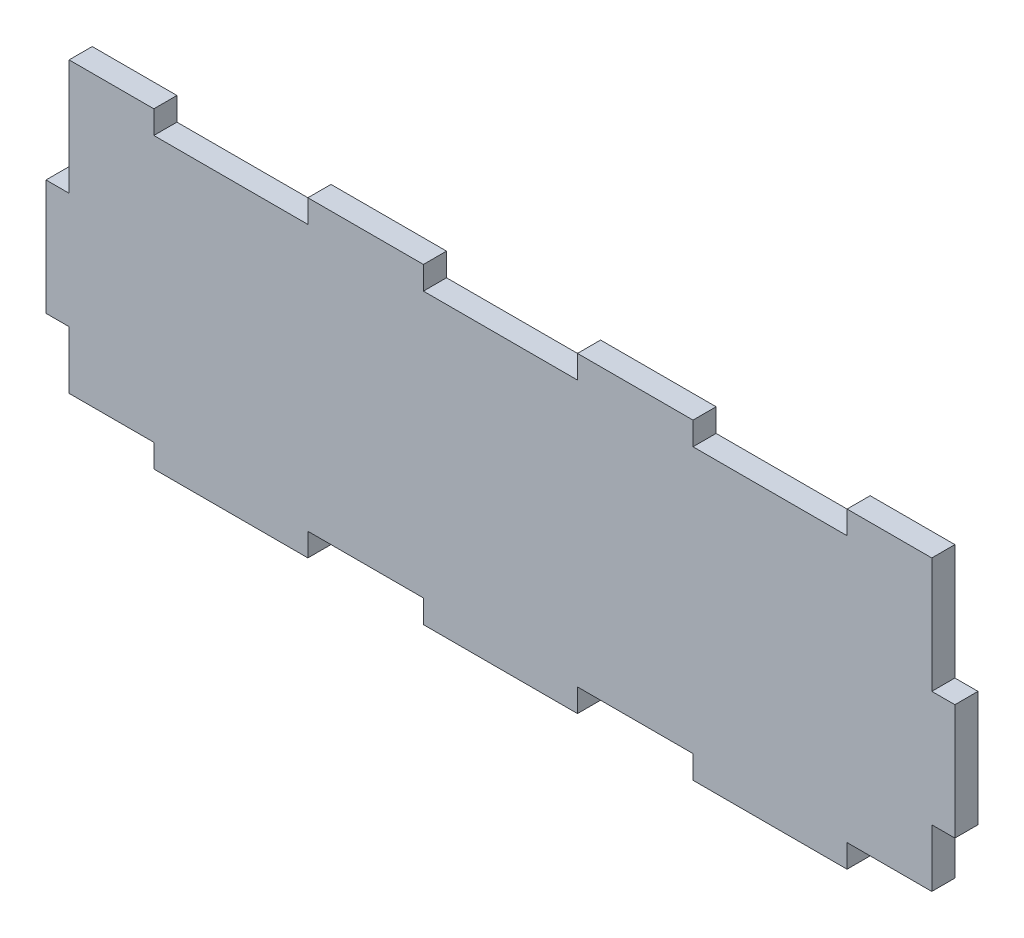
ISO-10303-21;
HEADER;
FILE_DESCRIPTION(('STEP AP214'),'2;1');
FILE_NAME('part.step','',(''),(''),'','','');
FILE_SCHEMA(('AUTOMOTIVE_DESIGN { 1 0 10303 214 1 1 1 1 }'));
ENDSEC;
DATA;
#1=APPLICATION_CONTEXT('core data for automotive mechanical design processes');
#2=APPLICATION_PROTOCOL_DEFINITION('international standard','automotive_design',2000,#1);
#3=PRODUCT_CONTEXT('',#1,'mechanical');
#4=PRODUCT('Part','Part','',(#3));
#5=PRODUCT_RELATED_PRODUCT_CATEGORY('part','',(#4));
#6=PRODUCT_DEFINITION_FORMATION('','',#4);
#7=PRODUCT_DEFINITION_CONTEXT('part definition',#1,'design');
#8=PRODUCT_DEFINITION('design','',#6,#7);
#9=PRODUCT_DEFINITION_SHAPE('','',#8);
#10=(LENGTH_UNIT() NAMED_UNIT(*) SI_UNIT(.MILLI.,.METRE.));
#11=(NAMED_UNIT(*) PLANE_ANGLE_UNIT() SI_UNIT($,.RADIAN.));
#12=(NAMED_UNIT(*) SI_UNIT($,.STERADIAN.) SOLID_ANGLE_UNIT());
#13=UNCERTAINTY_MEASURE_WITH_UNIT(LENGTH_MEASURE(1.E-05),#10,'distance_accuracy_value','');
#14=(GEOMETRIC_REPRESENTATION_CONTEXT(3) GLOBAL_UNCERTAINTY_ASSIGNED_CONTEXT((#13)) GLOBAL_UNIT_ASSIGNED_CONTEXT((#10,
#11,#12)) REPRESENTATION_CONTEXT('',''));
#15=CARTESIAN_POINT('',(0.,0.,0.));
#16=DIRECTION('',(0.,0.,1.));
#17=DIRECTION('',(1.,0.,0.));
#18=AXIS2_PLACEMENT_3D('',#15,#16,#17);
#19=CARTESIAN_POINT('',(-56.,0.,3.));
#20=DIRECTION('',(-1.,0.,0.));
#21=DIRECTION('',(0.,0.,1.));
#22=AXIS2_PLACEMENT_3D('',#19,#20,#21);
#23=PLANE('',#22);
#24=DIRECTION('',(0.,0.,-1.));
#25=VECTOR('',#24,1.);
#26=CARTESIAN_POINT('',(-56.,-7.5,3.));
#27=LINE('',#26,#25);
#28=CARTESIAN_POINT('',(-56.,-7.5,3.));
#29=VERTEX_POINT('',#28);
#30=CARTESIAN_POINT('',(-56.,-7.5,0.));
#31=VERTEX_POINT('',#30);
#32=EDGE_CURVE('E12',#29,#31,#27,.T.);
#33=ORIENTED_EDGE('',*,*,#32,.F.);
#34=DIRECTION('',(0.,1.,0.));
#35=VECTOR('',#34,1.);
#36=CARTESIAN_POINT('',(-56.,0.,3.));
#37=LINE('',#36,#35);
#38=CARTESIAN_POINT('',(-56.,7.5,3.));
#39=VERTEX_POINT('',#38);
#40=EDGE_CURVE('E538',#29,#39,#37,.T.);
#41=ORIENTED_EDGE('',*,*,#40,.T.);
#42=DIRECTION('',(0.,0.,-1.));
#43=VECTOR('',#42,1.);
#44=CARTESIAN_POINT('',(-56.,7.5,3.));
#45=LINE('',#44,#43);
#46=CARTESIAN_POINT('',(-56.,7.5,0.));
#47=VERTEX_POINT('',#46);
#48=EDGE_CURVE('E439',#39,#47,#45,.T.);
#49=ORIENTED_EDGE('',*,*,#48,.T.);
#50=DIRECTION('',(0.,1.,0.));
#51=VECTOR('',#50,1.);
#52=CARTESIAN_POINT('',(-56.,0.,0.));
#53=LINE('',#52,#51);
#54=EDGE_CURVE('E478',#31,#47,#53,.T.);
#55=ORIENTED_EDGE('',*,*,#54,.F.);
#56=EDGE_LOOP('',(#33,#41,#49,#55));
#57=FACE_BOUND('',#56,.T.);
#58=ADVANCED_FACE('F323',(#57),#23,.T.);
#59=CARTESIAN_POINT('',(0.,0.,0.));
#60=DIRECTION('',(0.,0.,1.));
#61=DIRECTION('',(1.,0.,0.));
#62=AXIS2_PLACEMENT_3D('',#59,#60,#61);
#63=PLANE('',#62);
#64=ORIENTED_EDGE('',*,*,#54,.T.);
#65=DIRECTION('',(1.,0.,0.));
#66=VECTOR('',#65,1.);
#67=CARTESIAN_POINT('',(0.,7.5,0.));
#68=LINE('',#67,#66);
#69=CARTESIAN_POINT('',(-45.,7.5,0.));
#70=VERTEX_POINT('',#69);
#71=EDGE_CURVE('E706',#47,#70,#68,.T.);
#72=ORIENTED_EDGE('',*,*,#71,.T.);
#73=DIRECTION('',(0.,1.,0.));
#74=VECTOR('',#73,1.);
#75=CARTESIAN_POINT('',(-45.,0.,0.));
#76=LINE('',#75,#74);
#77=CARTESIAN_POINT('',(-45.,4.5,0.));
#78=VERTEX_POINT('',#77);
#79=EDGE_CURVE('E420',#78,#70,#76,.T.);
#80=ORIENTED_EDGE('',*,*,#79,.F.);
#81=DIRECTION('',(1.,0.,0.));
#82=VECTOR('',#81,1.);
#83=CARTESIAN_POINT('',(0.,4.5,0.));
#84=LINE('',#83,#82);
#85=CARTESIAN_POINT('',(-25.,4.5,0.));
#86=VERTEX_POINT('',#85);
#87=EDGE_CURVE('E414',#78,#86,#84,.T.);
#88=ORIENTED_EDGE('',*,*,#87,.T.);
#89=DIRECTION('',(0.,1.,0.));
#90=VECTOR('',#89,1.);
#91=CARTESIAN_POINT('',(-25.,0.,0.));
#92=LINE('',#91,#90);
#93=CARTESIAN_POINT('',(-25.,7.5,0.));
#94=VERTEX_POINT('',#93);
#95=EDGE_CURVE('E702',#86,#94,#92,.T.);
#96=ORIENTED_EDGE('',*,*,#95,.T.);
#97=DIRECTION('',(1.,0.,0.));
#98=VECTOR('',#97,1.);
#99=CARTESIAN_POINT('',(0.,7.5,0.));
#100=LINE('',#99,#98);
#101=CARTESIAN_POINT('',(-9.99999999999999,7.5,0.));
#102=VERTEX_POINT('',#101);
#103=EDGE_CURVE('E698',#94,#102,#100,.T.);
#104=ORIENTED_EDGE('',*,*,#103,.T.);
#105=DIRECTION('',(0.,1.,0.));
#106=VECTOR('',#105,1.);
#107=CARTESIAN_POINT('',(-9.99999999999999,0.,0.));
#108=LINE('',#107,#106);
#109=CARTESIAN_POINT('',(-9.99999999999999,4.5,0.));
#110=VERTEX_POINT('',#109);
#111=EDGE_CURVE('E694',#110,#102,#108,.T.);
#112=ORIENTED_EDGE('',*,*,#111,.F.);
#113=DIRECTION('',(1.,0.,0.));
#114=VECTOR('',#113,1.);
#115=CARTESIAN_POINT('',(0.,4.5,0.));
#116=LINE('',#115,#114);
#117=CARTESIAN_POINT('',(10.,4.5,0.));
#118=VERTEX_POINT('',#117);
#119=EDGE_CURVE('E690',#110,#118,#116,.T.);
#120=ORIENTED_EDGE('',*,*,#119,.T.);
#121=DIRECTION('',(0.,1.,0.));
#122=VECTOR('',#121,1.);
#123=CARTESIAN_POINT('',(10.,0.,0.));
#124=LINE('',#123,#122);
#125=CARTESIAN_POINT('',(10.,7.5,0.));
#126=VERTEX_POINT('',#125);
#127=EDGE_CURVE('E686',#118,#126,#124,.T.);
#128=ORIENTED_EDGE('',*,*,#127,.T.);
#129=DIRECTION('',(1.,0.,0.));
#130=VECTOR('',#129,1.);
#131=CARTESIAN_POINT('',(0.,7.5,0.));
#132=LINE('',#131,#130);
#133=CARTESIAN_POINT('',(25.,7.5,0.));
#134=VERTEX_POINT('',#133);
#135=EDGE_CURVE('E682',#126,#134,#132,.T.);
#136=ORIENTED_EDGE('',*,*,#135,.T.);
#137=DIRECTION('',(0.,1.,0.));
#138=VECTOR('',#137,1.);
#139=CARTESIAN_POINT('',(25.,0.,0.));
#140=LINE('',#139,#138);
#141=CARTESIAN_POINT('',(25.,4.5,0.));
#142=VERTEX_POINT('',#141);
#143=EDGE_CURVE('E678',#142,#134,#140,.T.);
#144=ORIENTED_EDGE('',*,*,#143,.F.);
#145=DIRECTION('',(-1.,0.,0.));
#146=VECTOR('',#145,1.);
#147=CARTESIAN_POINT('',(0.,4.5,0.));
#148=LINE('',#147,#146);
#149=CARTESIAN_POINT('',(45.,4.5,0.));
#150=VERTEX_POINT('',#149);
#151=EDGE_CURVE('E674',#150,#142,#148,.T.);
#152=ORIENTED_EDGE('',*,*,#151,.F.);
#153=DIRECTION('',(0.,1.,0.));
#154=VECTOR('',#153,1.);
#155=CARTESIAN_POINT('',(45.,0.,0.));
#156=LINE('',#155,#154);
#157=CARTESIAN_POINT('',(45.,7.5,0.));
#158=VERTEX_POINT('',#157);
#159=EDGE_CURVE('E670',#150,#158,#156,.T.);
#160=ORIENTED_EDGE('',*,*,#159,.T.);
#161=DIRECTION('',(1.,0.,0.));
#162=VECTOR('',#161,1.);
#163=CARTESIAN_POINT('',(0.,7.5,0.));
#164=LINE('',#163,#162);
#165=CARTESIAN_POINT('',(56.,7.5,0.));
#166=VERTEX_POINT('',#165);
#167=EDGE_CURVE('E710',#158,#166,#164,.T.);
#168=ORIENTED_EDGE('',*,*,#167,.T.);
#169=DIRECTION('',(0.,1.,0.));
#170=VECTOR('',#169,1.);
#171=CARTESIAN_POINT('',(56.,0.,0.));
#172=LINE('',#171,#170);
#173=CARTESIAN_POINT('',(56.,-7.5,0.));
#174=VERTEX_POINT('',#173);
#175=EDGE_CURVE('E531',#174,#166,#172,.T.);
#176=ORIENTED_EDGE('',*,*,#175,.F.);
#177=DIRECTION('',(-1.,0.,0.));
#178=VECTOR('',#177,1.);
#179=CARTESIAN_POINT('',(59.,-7.5,0.));
#180=LINE('',#179,#178);
#181=CARTESIAN_POINT('',(59.,-7.5,0.));
#182=VERTEX_POINT('',#181);
#183=EDGE_CURVE('E457',#182,#174,#180,.T.);
#184=ORIENTED_EDGE('',*,*,#183,.F.);
#185=DIRECTION('',(0.,1.,0.));
#186=VECTOR('',#185,1.);
#187=CARTESIAN_POINT('',(59.,-22.5,0.));
#188=LINE('',#187,#186);
#189=CARTESIAN_POINT('',(59.,-22.5,0.));
#190=VERTEX_POINT('',#189);
#191=EDGE_CURVE('E460',#190,#182,#188,.T.);
#192=ORIENTED_EDGE('',*,*,#191,.F.);
#193=DIRECTION('',(-1.,0.,0.));
#194=VECTOR('',#193,1.);
#195=CARTESIAN_POINT('',(59.,-22.5,0.));
#196=LINE('',#195,#194);
#197=CARTESIAN_POINT('',(56.,-22.5,0.));
#198=VERTEX_POINT('',#197);
#199=EDGE_CURVE('E397',#190,#198,#196,.T.);
#200=ORIENTED_EDGE('',*,*,#199,.T.);
#201=CARTESIAN_POINT('',(56.,-30.,0.));
#202=VERTEX_POINT('',#201);
#203=EDGE_CURVE('E534',#202,#198,#172,.T.);
#204=ORIENTED_EDGE('',*,*,#203,.F.);
#205=DIRECTION('',(-1.,0.,0.));
#206=VECTOR('',#205,1.);
#207=CARTESIAN_POINT('',(0.,-30.,0.));
#208=LINE('',#207,#206);
#209=CARTESIAN_POINT('',(45.,-30.,0.));
#210=VERTEX_POINT('',#209);
#211=EDGE_CURVE('E487',#202,#210,#208,.T.);
#212=ORIENTED_EDGE('',*,*,#211,.T.);
#213=DIRECTION('',(0.,1.,0.));
#214=VECTOR('',#213,1.);
#215=CARTESIAN_POINT('',(45.,0.,0.));
#216=LINE('',#215,#214);
#217=CARTESIAN_POINT('',(45.,-33.,0.));
#218=VERTEX_POINT('',#217);
#219=EDGE_CURVE('E524',#218,#210,#216,.T.);
#220=ORIENTED_EDGE('',*,*,#219,.F.);
#221=DIRECTION('',(1.,0.,0.));
#222=VECTOR('',#221,1.);
#223=CARTESIAN_POINT('',(0.,-33.,0.));
#224=LINE('',#223,#222);
#225=CARTESIAN_POINT('',(25.,-33.,0.));
#226=VERTEX_POINT('',#225);
#227=EDGE_CURVE('E520',#226,#218,#224,.T.);
#228=ORIENTED_EDGE('',*,*,#227,.F.);
#229=DIRECTION('',(0.,1.,0.));
#230=VECTOR('',#229,1.);
#231=CARTESIAN_POINT('',(25.,0.,0.));
#232=LINE('',#231,#230);
#233=CARTESIAN_POINT('',(25.,-30.,0.));
#234=VERTEX_POINT('',#233);
#235=EDGE_CURVE('E517',#226,#234,#232,.T.);
#236=ORIENTED_EDGE('',*,*,#235,.T.);
#237=CARTESIAN_POINT('',(10.,-30.,0.));
#238=VERTEX_POINT('',#237);
#239=EDGE_CURVE('E503',#234,#238,#208,.T.);
#240=ORIENTED_EDGE('',*,*,#239,.T.);
#241=DIRECTION('',(0.,1.,0.));
#242=VECTOR('',#241,1.);
#243=CARTESIAN_POINT('',(10.,0.,0.));
#244=LINE('',#243,#242);
#245=CARTESIAN_POINT('',(10.,-33.,0.));
#246=VERTEX_POINT('',#245);
#247=EDGE_CURVE('E510',#246,#238,#244,.T.);
#248=ORIENTED_EDGE('',*,*,#247,.F.);
#249=DIRECTION('',(1.,0.,0.));
#250=VECTOR('',#249,1.);
#251=CARTESIAN_POINT('',(0.,-33.,0.));
#252=LINE('',#251,#250);
#253=CARTESIAN_POINT('',(-10.,-33.,0.));
#254=VERTEX_POINT('',#253);
#255=EDGE_CURVE('E506',#254,#246,#252,.T.);
#256=ORIENTED_EDGE('',*,*,#255,.F.);
#257=DIRECTION('',(0.,1.,0.));
#258=VECTOR('',#257,1.);
#259=CARTESIAN_POINT('',(-10.,0.,0.));
#260=LINE('',#259,#258);
#261=CARTESIAN_POINT('',(-10.,-30.,0.));
#262=VERTEX_POINT('',#261);
#263=EDGE_CURVE('E502',#254,#262,#260,.T.);
#264=ORIENTED_EDGE('',*,*,#263,.T.);
#265=CARTESIAN_POINT('',(-25.,-30.,0.));
#266=VERTEX_POINT('',#265);
#267=EDGE_CURVE('E488',#262,#266,#208,.T.);
#268=ORIENTED_EDGE('',*,*,#267,.T.);
#269=DIRECTION('',(0.,1.,0.));
#270=VECTOR('',#269,1.);
#271=CARTESIAN_POINT('',(-25.,0.,0.));
#272=LINE('',#271,#270);
#273=CARTESIAN_POINT('',(-25.,-33.,0.));
#274=VERTEX_POINT('',#273);
#275=EDGE_CURVE('E495',#274,#266,#272,.T.);
#276=ORIENTED_EDGE('',*,*,#275,.F.);
#277=DIRECTION('',(-1.,0.,0.));
#278=VECTOR('',#277,1.);
#279=CARTESIAN_POINT('',(0.,-33.,0.));
#280=LINE('',#279,#278);
#281=CARTESIAN_POINT('',(-45.,-33.,0.));
#282=VERTEX_POINT('',#281);
#283=EDGE_CURVE('E491',#274,#282,#280,.T.);
#284=ORIENTED_EDGE('',*,*,#283,.T.);
#285=DIRECTION('',(0.,1.,0.));
#286=VECTOR('',#285,1.);
#287=CARTESIAN_POINT('',(-45.,0.,0.));
#288=LINE('',#287,#286);
#289=CARTESIAN_POINT('',(-45.,-30.,0.));
#290=VERTEX_POINT('',#289);
#291=EDGE_CURVE('E485',#282,#290,#288,.T.);
#292=ORIENTED_EDGE('',*,*,#291,.T.);
#293=CARTESIAN_POINT('',(-56.,-30.,0.));
#294=VERTEX_POINT('',#293);
#295=EDGE_CURVE('E483',#290,#294,#208,.T.);
#296=ORIENTED_EDGE('',*,*,#295,.T.);
#297=CARTESIAN_POINT('',(-56.,-22.5,0.));
#298=VERTEX_POINT('',#297);
#299=EDGE_CURVE('E407',#294,#298,#53,.T.);
#300=ORIENTED_EDGE('',*,*,#299,.T.);
#301=DIRECTION('',(1.,0.,0.));
#302=VECTOR('',#301,1.);
#303=CARTESIAN_POINT('',(-59.,-22.5,0.));
#304=LINE('',#303,#302);
#305=CARTESIAN_POINT('',(-59.,-22.5,0.));
#306=VERTEX_POINT('',#305);
#307=EDGE_CURVE('E388',#306,#298,#304,.T.);
#308=ORIENTED_EDGE('',*,*,#307,.F.);
#309=DIRECTION('',(0.,1.,0.));
#310=VECTOR('',#309,1.);
#311=CARTESIAN_POINT('',(-59.,-22.5,0.));
#312=LINE('',#311,#310);
#313=CARTESIAN_POINT('',(-59.,-7.5,0.));
#314=VERTEX_POINT('',#313);
#315=EDGE_CURVE('E404',#306,#314,#312,.T.);
#316=ORIENTED_EDGE('',*,*,#315,.T.);
#317=DIRECTION('',(1.,0.,0.));
#318=VECTOR('',#317,1.);
#319=CARTESIAN_POINT('',(-59.,-7.5,0.));
#320=LINE('',#319,#318);
#321=EDGE_CURVE('E410',#314,#31,#320,.T.);
#322=ORIENTED_EDGE('',*,*,#321,.T.);
#323=EDGE_LOOP('',(#64,#72,#80,#88,#96,#104,#112,#120,#128,#136,#144,#152,#160,#168,#176,#184,
#192,#200,#204,#212,#220,#228,#236,#240,#248,#256,#264,#268,#276,#284,#292,#296,#300,#308,#316,#322));
#324=FACE_BOUND('',#323,.T.);
#325=ADVANCED_FACE('F402',(#324),#63,.F.);
#326=CARTESIAN_POINT('',(0.,-30.,3.));
#327=DIRECTION('',(0.,-1.,0.));
#328=DIRECTION('',(1.,0.,0.));
#329=AXIS2_PLACEMENT_3D('',#326,#327,#328);
#330=PLANE('',#329);
#331=ORIENTED_EDGE('',*,*,#295,.F.);
#332=DIRECTION('',(0.,0.,-1.));
#333=VECTOR('',#332,1.);
#334=CARTESIAN_POINT('',(-45.,-30.,3.));
#335=LINE('',#334,#333);
#336=CARTESIAN_POINT('',(-45.,-30.,3.));
#337=VERTEX_POINT('',#336);
#338=EDGE_CURVE('E651',#337,#290,#335,.T.);
#339=ORIENTED_EDGE('',*,*,#338,.F.);
#340=DIRECTION('',(-1.,0.,0.));
#341=VECTOR('',#340,1.);
#342=CARTESIAN_POINT('',(0.,-30.,3.));
#343=LINE('',#342,#341);
#344=CARTESIAN_POINT('',(-56.,-30.,3.));
#345=VERTEX_POINT('',#344);
#346=EDGE_CURVE('E544',#337,#345,#343,.T.);
#347=ORIENTED_EDGE('',*,*,#346,.T.);
#348=DIRECTION('',(0.,0.,-1.));
#349=VECTOR('',#348,1.);
#350=CARTESIAN_POINT('',(-56.,-30.,3.));
#351=LINE('',#350,#349);
#352=EDGE_CURVE('E655',#345,#294,#351,.T.);
#353=ORIENTED_EDGE('',*,*,#352,.T.);
#354=EDGE_LOOP('',(#331,#339,#347,#353));
#355=FACE_BOUND('',#354,.T.);
#356=ADVANCED_FACE('F1012',(#355),#330,.T.);
#357=ORIENTED_EDGE('',*,*,#267,.F.);
#358=DIRECTION('',(0.,0.,-1.));
#359=VECTOR('',#358,1.);
#360=CARTESIAN_POINT('',(-10.,-30.,3.));
#361=LINE('',#360,#359);
#362=CARTESIAN_POINT('',(-10.,-30.,3.));
#363=VERTEX_POINT('',#362);
#364=EDGE_CURVE('E635',#363,#262,#361,.T.);
#365=ORIENTED_EDGE('',*,*,#364,.F.);
#366=CARTESIAN_POINT('',(-25.,-30.,3.));
#367=VERTEX_POINT('',#366);
#368=EDGE_CURVE('E550',#363,#367,#343,.T.);
#369=ORIENTED_EDGE('',*,*,#368,.T.);
#370=DIRECTION('',(0.,0.,-1.));
#371=VECTOR('',#370,1.);
#372=CARTESIAN_POINT('',(-25.,-30.,3.));
#373=LINE('',#372,#371);
#374=EDGE_CURVE('E639',#367,#266,#373,.T.);
#375=ORIENTED_EDGE('',*,*,#374,.T.);
#376=EDGE_LOOP('',(#357,#365,#369,#375));
#377=FACE_BOUND('',#376,.T.);
#378=ADVANCED_FACE('F1019',(#377),#330,.T.);
#379=ORIENTED_EDGE('',*,*,#239,.F.);
#380=DIRECTION('',(0.,0.,-1.));
#381=VECTOR('',#380,1.);
#382=CARTESIAN_POINT('',(25.,-30.,3.));
#383=LINE('',#382,#381);
#384=CARTESIAN_POINT('',(25.,-30.,3.));
#385=VERTEX_POINT('',#384);
#386=EDGE_CURVE('E619',#385,#234,#383,.T.);
#387=ORIENTED_EDGE('',*,*,#386,.F.);
#388=CARTESIAN_POINT('',(10.,-30.,3.));
#389=VERTEX_POINT('',#388);
#390=EDGE_CURVE('E565',#385,#389,#343,.T.);
#391=ORIENTED_EDGE('',*,*,#390,.T.);
#392=DIRECTION('',(0.,0.,-1.));
#393=VECTOR('',#392,1.);
#394=CARTESIAN_POINT('',(10.,-30.,3.));
#395=LINE('',#394,#393);
#396=EDGE_CURVE('E623',#389,#238,#395,.T.);
#397=ORIENTED_EDGE('',*,*,#396,.T.);
#398=EDGE_LOOP('',(#379,#387,#391,#397));
#399=FACE_BOUND('',#398,.T.);
#400=ADVANCED_FACE('F1033',(#399),#330,.T.);
#401=ORIENTED_EDGE('',*,*,#211,.F.);
#402=DIRECTION('',(0.,0.,-1.));
#403=VECTOR('',#402,1.);
#404=CARTESIAN_POINT('',(56.,-30.,3.));
#405=LINE('',#404,#403);
#406=CARTESIAN_POINT('',(56.,-30.,3.));
#407=VERTEX_POINT('',#406);
#408=EDGE_CURVE('E603',#407,#202,#405,.T.);
#409=ORIENTED_EDGE('',*,*,#408,.F.);
#410=CARTESIAN_POINT('',(45.,-30.,3.));
#411=VERTEX_POINT('',#410);
#412=EDGE_CURVE('E549',#407,#411,#343,.T.);
#413=ORIENTED_EDGE('',*,*,#412,.T.);
#414=DIRECTION('',(0.,0.,-1.));
#415=VECTOR('',#414,1.);
#416=CARTESIAN_POINT('',(45.,-30.,3.));
#417=LINE('',#416,#415);
#418=EDGE_CURVE('E607',#411,#210,#417,.T.);
#419=ORIENTED_EDGE('',*,*,#418,.T.);
#420=EDGE_LOOP('',(#401,#409,#413,#419));
#421=FACE_BOUND('',#420,.T.);
#422=ADVANCED_FACE('F1022',(#421),#330,.T.);
#423=CARTESIAN_POINT('',(56.,0.,3.));
#424=DIRECTION('',(-1.,0.,0.));
#425=DIRECTION('',(0.,0.,1.));
#426=AXIS2_PLACEMENT_3D('',#423,#424,#425);
#427=PLANE('',#426);
#428=DIRECTION('',(0.,1.,0.));
#429=VECTOR('',#428,1.);
#430=CARTESIAN_POINT('',(56.,0.,3.));
#431=LINE('',#430,#429);
#432=CARTESIAN_POINT('',(56.,-7.5,3.));
#433=VERTEX_POINT('',#432);
#434=CARTESIAN_POINT('',(56.,7.5,3.));
#435=VERTEX_POINT('',#434);
#436=EDGE_CURVE('E593',#433,#435,#431,.T.);
#437=ORIENTED_EDGE('',*,*,#436,.F.);
#438=DIRECTION('',(0.,0.,-1.));
#439=VECTOR('',#438,1.);
#440=CARTESIAN_POINT('',(56.,-7.5,3.));
#441=LINE('',#440,#439);
#442=EDGE_CURVE('E349',#433,#174,#441,.T.);
#443=ORIENTED_EDGE('',*,*,#442,.T.);
#444=ORIENTED_EDGE('',*,*,#175,.T.);
#445=DIRECTION('',(0.,0.,-1.));
#446=VECTOR('',#445,1.);
#447=CARTESIAN_POINT('',(56.,7.5,3.));
#448=LINE('',#447,#446);
#449=EDGE_CURVE('E600',#435,#166,#448,.T.);
#450=ORIENTED_EDGE('',*,*,#449,.F.);
#451=EDGE_LOOP('',(#437,#443,#444,#450));
#452=FACE_BOUND('',#451,.T.);
#453=ADVANCED_FACE('F977',(#452),#427,.F.);
#454=CARTESIAN_POINT('',(-56.,-22.5,3.));
#455=VERTEX_POINT('',#454);
#456=EDGE_CURVE('E541',#345,#455,#37,.T.);
#457=ORIENTED_EDGE('',*,*,#456,.T.);
#458=DIRECTION('',(0.,0.,-1.));
#459=VECTOR('',#458,1.);
#460=CARTESIAN_POINT('',(-56.,-22.5,3.));
#461=LINE('',#460,#459);
#462=EDGE_CURVE('E333',#455,#298,#461,.T.);
#463=ORIENTED_EDGE('',*,*,#462,.T.);
#464=ORIENTED_EDGE('',*,*,#299,.F.);
#465=ORIENTED_EDGE('',*,*,#352,.F.);
#466=EDGE_LOOP('',(#457,#463,#464,#465));
#467=FACE_BOUND('',#466,.T.);
#468=ADVANCED_FACE('F1025',(#467),#23,.T.);
#469=DIRECTION('',(0.,0.,-1.));
#470=VECTOR('',#469,1.);
#471=CARTESIAN_POINT('',(56.,-22.5,3.));
#472=LINE('',#471,#470);
#473=CARTESIAN_POINT('',(56.,-22.5,3.));
#474=VERTEX_POINT('',#473);
#475=EDGE_CURVE('E427',#474,#198,#472,.T.);
#476=ORIENTED_EDGE('',*,*,#475,.F.);
#477=EDGE_CURVE('E596',#407,#474,#431,.T.);
#478=ORIENTED_EDGE('',*,*,#477,.F.);
#479=ORIENTED_EDGE('',*,*,#408,.T.);
#480=ORIENTED_EDGE('',*,*,#203,.T.);
#481=EDGE_LOOP('',(#476,#478,#479,#480));
#482=FACE_BOUND('',#481,.T.);
#483=ADVANCED_FACE('F1029',(#482),#427,.F.);
#484=CARTESIAN_POINT('',(0.,0.,3.));
#485=DIRECTION('',(0.,0.,1.));
#486=DIRECTION('',(1.,0.,0.));
#487=AXIS2_PLACEMENT_3D('',#484,#485,#486);
#488=PLANE('',#487);
#489=DIRECTION('',(1.,0.,0.));
#490=VECTOR('',#489,1.);
#491=CARTESIAN_POINT('',(0.,7.5,3.));
#492=LINE('',#491,#490);
#493=CARTESIAN_POINT('',(-45.,7.5,3.));
#494=VERTEX_POINT('',#493);
#495=EDGE_CURVE('E764',#39,#494,#492,.T.);
#496=ORIENTED_EDGE('',*,*,#495,.F.);
#497=ORIENTED_EDGE('',*,*,#40,.F.);
#498=DIRECTION('',(1.,0.,0.));
#499=VECTOR('',#498,1.);
#500=CARTESIAN_POINT('',(-59.,-7.5,3.));
#501=LINE('',#500,#499);
#502=CARTESIAN_POINT('',(-59.,-7.5,3.));
#503=VERTEX_POINT('',#502);
#504=EDGE_CURVE('E444',#503,#29,#501,.T.);
#505=ORIENTED_EDGE('',*,*,#504,.F.);
#506=DIRECTION('',(0.,1.,0.));
#507=VECTOR('',#506,1.);
#508=CARTESIAN_POINT('',(-59.,-22.5,3.));
#509=LINE('',#508,#507);
#510=CARTESIAN_POINT('',(-59.,-22.5,3.));
#511=VERTEX_POINT('',#510);
#512=EDGE_CURVE('E409',#511,#503,#509,.T.);
#513=ORIENTED_EDGE('',*,*,#512,.F.);
#514=DIRECTION('',(1.,0.,0.));
#515=VECTOR('',#514,1.);
#516=CARTESIAN_POINT('',(-59.,-22.5,3.));
#517=LINE('',#516,#515);
#518=EDGE_CURVE('E391',#511,#455,#517,.T.);
#519=ORIENTED_EDGE('',*,*,#518,.T.);
#520=ORIENTED_EDGE('',*,*,#456,.F.);
#521=ORIENTED_EDGE('',*,*,#346,.F.);
#522=DIRECTION('',(0.,1.,0.));
#523=VECTOR('',#522,1.);
#524=CARTESIAN_POINT('',(-45.,0.,3.));
#525=LINE('',#524,#523);
#526=CARTESIAN_POINT('',(-45.,-33.,3.));
#527=VERTEX_POINT('',#526);
#528=EDGE_CURVE('E547',#527,#337,#525,.T.);
#529=ORIENTED_EDGE('',*,*,#528,.F.);
#530=DIRECTION('',(-1.,0.,0.));
#531=VECTOR('',#530,1.);
#532=CARTESIAN_POINT('',(0.,-33.,3.));
#533=LINE('',#532,#531);
#534=CARTESIAN_POINT('',(-25.,-33.,3.));
#535=VERTEX_POINT('',#534);
#536=EDGE_CURVE('E553',#535,#527,#533,.T.);
#537=ORIENTED_EDGE('',*,*,#536,.F.);
#538=DIRECTION('',(0.,1.,0.));
#539=VECTOR('',#538,1.);
#540=CARTESIAN_POINT('',(-25.,0.,3.));
#541=LINE('',#540,#539);
#542=EDGE_CURVE('E557',#535,#367,#541,.T.);
#543=ORIENTED_EDGE('',*,*,#542,.T.);
#544=ORIENTED_EDGE('',*,*,#368,.F.);
#545=DIRECTION('',(0.,1.,0.));
#546=VECTOR('',#545,1.);
#547=CARTESIAN_POINT('',(-10.,0.,3.));
#548=LINE('',#547,#546);
#549=CARTESIAN_POINT('',(-10.,-33.,3.));
#550=VERTEX_POINT('',#549);
#551=EDGE_CURVE('E564',#550,#363,#548,.T.);
#552=ORIENTED_EDGE('',*,*,#551,.F.);
#553=DIRECTION('',(1.,0.,0.));
#554=VECTOR('',#553,1.);
#555=CARTESIAN_POINT('',(0.,-33.,3.));
#556=LINE('',#555,#554);
#557=CARTESIAN_POINT('',(10.,-33.,3.));
#558=VERTEX_POINT('',#557);
#559=EDGE_CURVE('E568',#550,#558,#556,.T.);
#560=ORIENTED_EDGE('',*,*,#559,.T.);
#561=DIRECTION('',(0.,1.,0.));
#562=VECTOR('',#561,1.);
#563=CARTESIAN_POINT('',(10.,0.,3.));
#564=LINE('',#563,#562);
#565=EDGE_CURVE('E572',#558,#389,#564,.T.);
#566=ORIENTED_EDGE('',*,*,#565,.T.);
#567=ORIENTED_EDGE('',*,*,#390,.F.);
#568=DIRECTION('',(0.,1.,0.));
#569=VECTOR('',#568,1.);
#570=CARTESIAN_POINT('',(25.,0.,3.));
#571=LINE('',#570,#569);
#572=CARTESIAN_POINT('',(25.,-33.,3.));
#573=VERTEX_POINT('',#572);
#574=EDGE_CURVE('E579',#573,#385,#571,.T.);
#575=ORIENTED_EDGE('',*,*,#574,.F.);
#576=DIRECTION('',(1.,0.,0.));
#577=VECTOR('',#576,1.);
#578=CARTESIAN_POINT('',(0.,-33.,3.));
#579=LINE('',#578,#577);
#580=CARTESIAN_POINT('',(45.,-33.,3.));
#581=VERTEX_POINT('',#580);
#582=EDGE_CURVE('E582',#573,#581,#579,.T.);
#583=ORIENTED_EDGE('',*,*,#582,.T.);
#584=DIRECTION('',(0.,1.,0.));
#585=VECTOR('',#584,1.);
#586=CARTESIAN_POINT('',(45.,0.,3.));
#587=LINE('',#586,#585);
#588=EDGE_CURVE('E586',#581,#411,#587,.T.);
#589=ORIENTED_EDGE('',*,*,#588,.T.);
#590=ORIENTED_EDGE('',*,*,#412,.F.);
#591=ORIENTED_EDGE('',*,*,#477,.T.);
#592=DIRECTION('',(-1.,0.,0.));
#593=VECTOR('',#592,1.);
#594=CARTESIAN_POINT('',(59.,-22.5,3.));
#595=LINE('',#594,#593);
#596=CARTESIAN_POINT('',(59.,-22.5,3.));
#597=VERTEX_POINT('',#596);
#598=EDGE_CURVE('E463',#597,#474,#595,.T.);
#599=ORIENTED_EDGE('',*,*,#598,.F.);
#600=DIRECTION('',(0.,1.,0.));
#601=VECTOR('',#600,1.);
#602=CARTESIAN_POINT('',(59.,-22.5,3.));
#603=LINE('',#602,#601);
#604=CARTESIAN_POINT('',(59.,-7.5,3.));
#605=VERTEX_POINT('',#604);
#606=EDGE_CURVE('E469',#597,#605,#603,.T.);
#607=ORIENTED_EDGE('',*,*,#606,.T.);
#608=DIRECTION('',(-1.,0.,0.));
#609=VECTOR('',#608,1.);
#610=CARTESIAN_POINT('',(59.,-7.5,3.));
#611=LINE('',#610,#609);
#612=EDGE_CURVE('E466',#605,#433,#611,.T.);
#613=ORIENTED_EDGE('',*,*,#612,.T.);
#614=ORIENTED_EDGE('',*,*,#436,.T.);
#615=CARTESIAN_POINT('',(45.,7.5,3.));
#616=VERTEX_POINT('',#615);
#617=EDGE_CURVE('E769',#616,#435,#492,.T.);
#618=ORIENTED_EDGE('',*,*,#617,.F.);
#619=DIRECTION('',(0.,1.,0.));
#620=VECTOR('',#619,1.);
#621=CARTESIAN_POINT('',(45.,0.,3.));
#622=LINE('',#621,#620);
#623=CARTESIAN_POINT('',(45.,4.5,3.));
#624=VERTEX_POINT('',#623);
#625=EDGE_CURVE('E765',#624,#616,#622,.T.);
#626=ORIENTED_EDGE('',*,*,#625,.F.);
#627=DIRECTION('',(-1.,0.,0.));
#628=VECTOR('',#627,1.);
#629=CARTESIAN_POINT('',(0.,4.5,3.));
#630=LINE('',#629,#628);
#631=CARTESIAN_POINT('',(25.,4.5,3.));
#632=VERTEX_POINT('',#631);
#633=EDGE_CURVE('E770',#624,#632,#630,.T.);
#634=ORIENTED_EDGE('',*,*,#633,.T.);
#635=DIRECTION('',(0.,1.,0.));
#636=VECTOR('',#635,1.);
#637=CARTESIAN_POINT('',(25.,0.,3.));
#638=LINE('',#637,#636);
#639=CARTESIAN_POINT('',(25.,7.5,3.));
#640=VERTEX_POINT('',#639);
#641=EDGE_CURVE('E774',#632,#640,#638,.T.);
#642=ORIENTED_EDGE('',*,*,#641,.T.);
#643=CARTESIAN_POINT('',(10.,7.5,3.));
#644=VERTEX_POINT('',#643);
#645=EDGE_CURVE('E778',#644,#640,#492,.T.);
#646=ORIENTED_EDGE('',*,*,#645,.F.);
#647=DIRECTION('',(0.,1.,0.));
#648=VECTOR('',#647,1.);
#649=CARTESIAN_POINT('',(10.,0.,3.));
#650=LINE('',#649,#648);
#651=CARTESIAN_POINT('',(10.,4.5,3.));
#652=VERTEX_POINT('',#651);
#653=EDGE_CURVE('E779',#652,#644,#650,.T.);
#654=ORIENTED_EDGE('',*,*,#653,.F.);
#655=DIRECTION('',(1.,0.,0.));
#656=VECTOR('',#655,1.);
#657=CARTESIAN_POINT('',(0.,4.5,3.));
#658=LINE('',#657,#656);
#659=CARTESIAN_POINT('',(-9.99999999999999,4.5,3.));
#660=VERTEX_POINT('',#659);
#661=EDGE_CURVE('E783',#660,#652,#658,.T.);
#662=ORIENTED_EDGE('',*,*,#661,.F.);
#663=DIRECTION('',(0.,1.,0.));
#664=VECTOR('',#663,1.);
#665=CARTESIAN_POINT('',(-9.99999999999999,0.,3.));
#666=LINE('',#665,#664);
#667=CARTESIAN_POINT('',(-9.99999999999999,7.5,3.));
#668=VERTEX_POINT('',#667);
#669=EDGE_CURVE('E787',#660,#668,#666,.T.);
#670=ORIENTED_EDGE('',*,*,#669,.T.);
#671=CARTESIAN_POINT('',(-25.,7.5,3.));
#672=VERTEX_POINT('',#671);
#673=EDGE_CURVE('E791',#672,#668,#492,.T.);
#674=ORIENTED_EDGE('',*,*,#673,.F.);
#675=DIRECTION('',(0.,1.,0.));
#676=VECTOR('',#675,1.);
#677=CARTESIAN_POINT('',(-25.,0.,3.));
#678=LINE('',#677,#676);
#679=CARTESIAN_POINT('',(-25.,4.5,3.));
#680=VERTEX_POINT('',#679);
#681=EDGE_CURVE('E795',#680,#672,#678,.T.);
#682=ORIENTED_EDGE('',*,*,#681,.F.);
#683=DIRECTION('',(1.,0.,0.));
#684=VECTOR('',#683,1.);
#685=CARTESIAN_POINT('',(0.,4.5,3.));
#686=LINE('',#685,#684);
#687=CARTESIAN_POINT('',(-45.,4.5,3.));
#688=VERTEX_POINT('',#687);
#689=EDGE_CURVE('E340',#688,#680,#686,.T.);
#690=ORIENTED_EDGE('',*,*,#689,.F.);
#691=DIRECTION('',(0.,1.,0.));
#692=VECTOR('',#691,1.);
#693=CARTESIAN_POINT('',(-45.,0.,3.));
#694=LINE('',#693,#692);
#695=EDGE_CURVE('E719',#688,#494,#694,.T.);
#696=ORIENTED_EDGE('',*,*,#695,.T.);
#697=EDGE_LOOP('',(#496,#497,#505,#513,#519,#520,#521,#529,#537,#543,#544,#552,#560,#566,#567,
#575,#583,#589,#590,#591,#599,#607,#613,#614,#618,#626,#634,#642,#646,#654,#662,#670,#674,#682,
#690,#696));
#698=FACE_BOUND('',#697,.T.);
#699=ADVANCED_FACE('F818',(#698),#488,.T.);
#700=CARTESIAN_POINT('',(-59.,-22.5,3.));
#701=DIRECTION('',(0.,1.,0.));
#702=DIRECTION('',(0.,0.,1.));
#703=AXIS2_PLACEMENT_3D('',#700,#701,#702);
#704=PLANE('',#703);
#705=ORIENTED_EDGE('',*,*,#307,.T.);
#706=ORIENTED_EDGE('',*,*,#462,.F.);
#707=ORIENTED_EDGE('',*,*,#518,.F.);
#708=DIRECTION('',(0.,0.,-1.));
#709=VECTOR('',#708,1.);
#710=CARTESIAN_POINT('',(-59.,-22.5,3.));
#711=LINE('',#710,#709);
#712=EDGE_CURVE('E383',#511,#306,#711,.T.);
#713=ORIENTED_EDGE('',*,*,#712,.T.);
#714=EDGE_LOOP('',(#705,#706,#707,#713));
#715=FACE_BOUND('',#714,.T.);
#716=ADVANCED_FACE('F385',(#715),#704,.F.);
#717=CARTESIAN_POINT('',(-59.,-7.5,3.));
#718=DIRECTION('',(0.,1.,0.));
#719=DIRECTION('',(0.,0.,1.));
#720=AXIS2_PLACEMENT_3D('',#717,#718,#719);
#721=PLANE('',#720);
#722=ORIENTED_EDGE('',*,*,#321,.F.);
#723=DIRECTION('',(0.,0.,-1.));
#724=VECTOR('',#723,1.);
#725=CARTESIAN_POINT('',(-59.,-7.5,3.));
#726=LINE('',#725,#724);
#727=EDGE_CURVE('E327',#503,#314,#726,.T.);
#728=ORIENTED_EDGE('',*,*,#727,.F.);
#729=ORIENTED_EDGE('',*,*,#504,.T.);
#730=ORIENTED_EDGE('',*,*,#32,.T.);
#731=EDGE_LOOP('',(#722,#728,#729,#730));
#732=FACE_BOUND('',#731,.T.);
#733=ADVANCED_FACE('F937',(#732),#721,.T.);
#734=CARTESIAN_POINT('',(-59.,-22.5,3.));
#735=DIRECTION('',(-1.,0.,0.));
#736=DIRECTION('',(0.,0.,1.));
#737=AXIS2_PLACEMENT_3D('',#734,#735,#736);
#738=PLANE('',#737);
#739=ORIENTED_EDGE('',*,*,#315,.F.);
#740=ORIENTED_EDGE('',*,*,#712,.F.);
#741=ORIENTED_EDGE('',*,*,#512,.T.);
#742=ORIENTED_EDGE('',*,*,#727,.T.);
#743=EDGE_LOOP('',(#739,#740,#741,#742));
#744=FACE_BOUND('',#743,.T.);
#745=ADVANCED_FACE('F325',(#744),#738,.T.);
#746=CARTESIAN_POINT('',(-45.,0.,3.));
#747=DIRECTION('',(-1.,0.,0.));
#748=DIRECTION('',(0.,0.,1.));
#749=AXIS2_PLACEMENT_3D('',#746,#747,#748);
#750=PLANE('',#749);
#751=ORIENTED_EDGE('',*,*,#291,.F.);
#752=DIRECTION('',(0.,0.,-1.));
#753=VECTOR('',#752,1.);
#754=CARTESIAN_POINT('',(-45.,-33.,3.));
#755=LINE('',#754,#753);
#756=EDGE_CURVE('E647',#527,#282,#755,.T.);
#757=ORIENTED_EDGE('',*,*,#756,.F.);
#758=ORIENTED_EDGE('',*,*,#528,.T.);
#759=ORIENTED_EDGE('',*,*,#338,.T.);
#760=EDGE_LOOP('',(#751,#757,#758,#759));
#761=FACE_BOUND('',#760,.T.);
#762=ADVANCED_FACE('F1023',(#761),#750,.T.);
#763=CARTESIAN_POINT('',(0.,-33.,3.));
#764=DIRECTION('',(0.,-1.,0.));
#765=DIRECTION('',(0.,0.,-1.));
#766=AXIS2_PLACEMENT_3D('',#763,#764,#765);
#767=PLANE('',#766);
#768=ORIENTED_EDGE('',*,*,#283,.F.);
#769=DIRECTION('',(0.,0.,-1.));
#770=VECTOR('',#769,1.);
#771=CARTESIAN_POINT('',(-25.,-33.,3.));
#772=LINE('',#771,#770);
#773=EDGE_CURVE('E643',#535,#274,#772,.T.);
#774=ORIENTED_EDGE('',*,*,#773,.F.);
#775=ORIENTED_EDGE('',*,*,#536,.T.);
#776=ORIENTED_EDGE('',*,*,#756,.T.);
#777=EDGE_LOOP('',(#768,#774,#775,#776));
#778=FACE_BOUND('',#777,.T.);
#779=ADVANCED_FACE('F1063',(#778),#767,.T.);
#780=CARTESIAN_POINT('',(-25.,0.,3.));
#781=DIRECTION('',(-1.,0.,0.));
#782=DIRECTION('',(0.,0.,1.));
#783=AXIS2_PLACEMENT_3D('',#780,#781,#782);
#784=PLANE('',#783);
#785=ORIENTED_EDGE('',*,*,#275,.T.);
#786=ORIENTED_EDGE('',*,*,#374,.F.);
#787=ORIENTED_EDGE('',*,*,#542,.F.);
#788=ORIENTED_EDGE('',*,*,#773,.T.);
#789=EDGE_LOOP('',(#785,#786,#787,#788));
#790=FACE_BOUND('',#789,.T.);
#791=ADVANCED_FACE('F1059',(#790),#784,.F.);
#792=CARTESIAN_POINT('',(-10.,0.,3.));
#793=DIRECTION('',(-1.,0.,0.));
#794=DIRECTION('',(0.,0.,1.));
#795=AXIS2_PLACEMENT_3D('',#792,#793,#794);
#796=PLANE('',#795);
#797=ORIENTED_EDGE('',*,*,#263,.F.);
#798=DIRECTION('',(0.,0.,-1.));
#799=VECTOR('',#798,1.);
#800=CARTESIAN_POINT('',(-10.,-33.,3.));
#801=LINE('',#800,#799);
#802=EDGE_CURVE('E631',#550,#254,#801,.T.);
#803=ORIENTED_EDGE('',*,*,#802,.F.);
#804=ORIENTED_EDGE('',*,*,#551,.T.);
#805=ORIENTED_EDGE('',*,*,#364,.T.);
#806=EDGE_LOOP('',(#797,#803,#804,#805));
#807=FACE_BOUND('',#806,.T.);
#808=ADVANCED_FACE('F1055',(#807),#796,.T.);
#809=CARTESIAN_POINT('',(0.,-33.,3.));
#810=DIRECTION('',(0.,1.,0.));
#811=DIRECTION('',(0.,0.,1.));
#812=AXIS2_PLACEMENT_3D('',#809,#810,#811);
#813=PLANE('',#812);
#814=ORIENTED_EDGE('',*,*,#255,.T.);
#815=DIRECTION('',(0.,0.,-1.));
#816=VECTOR('',#815,1.);
#817=CARTESIAN_POINT('',(10.,-33.,3.));
#818=LINE('',#817,#816);
#819=EDGE_CURVE('E627',#558,#246,#818,.T.);
#820=ORIENTED_EDGE('',*,*,#819,.F.);
#821=ORIENTED_EDGE('',*,*,#559,.F.);
#822=ORIENTED_EDGE('',*,*,#802,.T.);
#823=EDGE_LOOP('',(#814,#820,#821,#822));
#824=FACE_BOUND('',#823,.T.);
#825=ADVANCED_FACE('F1051',(#824),#813,.F.);
#826=CARTESIAN_POINT('',(10.,0.,3.));
#827=DIRECTION('',(-1.,0.,0.));
#828=DIRECTION('',(0.,0.,1.));
#829=AXIS2_PLACEMENT_3D('',#826,#827,#828);
#830=PLANE('',#829);
#831=ORIENTED_EDGE('',*,*,#247,.T.);
#832=ORIENTED_EDGE('',*,*,#396,.F.);
#833=ORIENTED_EDGE('',*,*,#565,.F.);
#834=ORIENTED_EDGE('',*,*,#819,.T.);
#835=EDGE_LOOP('',(#831,#832,#833,#834));
#836=FACE_BOUND('',#835,.T.);
#837=ADVANCED_FACE('F1047',(#836),#830,.F.);
#838=CARTESIAN_POINT('',(25.,0.,3.));
#839=DIRECTION('',(-1.,0.,0.));
#840=DIRECTION('',(0.,0.,1.));
#841=AXIS2_PLACEMENT_3D('',#838,#839,#840);
#842=PLANE('',#841);
#843=ORIENTED_EDGE('',*,*,#235,.F.);
#844=DIRECTION('',(0.,0.,-1.));
#845=VECTOR('',#844,1.);
#846=CARTESIAN_POINT('',(25.,-33.,3.));
#847=LINE('',#846,#845);
#848=EDGE_CURVE('E615',#573,#226,#847,.T.);
#849=ORIENTED_EDGE('',*,*,#848,.F.);
#850=ORIENTED_EDGE('',*,*,#574,.T.);
#851=ORIENTED_EDGE('',*,*,#386,.T.);
#852=EDGE_LOOP('',(#843,#849,#850,#851));
#853=FACE_BOUND('',#852,.T.);
#854=ADVANCED_FACE('F1043',(#853),#842,.T.);
#855=CARTESIAN_POINT('',(0.,-33.,3.));
#856=DIRECTION('',(0.,1.,0.));
#857=DIRECTION('',(0.,0.,1.));
#858=AXIS2_PLACEMENT_3D('',#855,#856,#857);
#859=PLANE('',#858);
#860=ORIENTED_EDGE('',*,*,#227,.T.);
#861=DIRECTION('',(0.,0.,-1.));
#862=VECTOR('',#861,1.);
#863=CARTESIAN_POINT('',(45.,-33.,3.));
#864=LINE('',#863,#862);
#865=EDGE_CURVE('E611',#581,#218,#864,.T.);
#866=ORIENTED_EDGE('',*,*,#865,.F.);
#867=ORIENTED_EDGE('',*,*,#582,.F.);
#868=ORIENTED_EDGE('',*,*,#848,.T.);
#869=EDGE_LOOP('',(#860,#866,#867,#868));
#870=FACE_BOUND('',#869,.T.);
#871=ADVANCED_FACE('F1039',(#870),#859,.F.);
#872=CARTESIAN_POINT('',(45.,0.,3.));
#873=DIRECTION('',(-1.,0.,0.));
#874=DIRECTION('',(0.,0.,1.));
#875=AXIS2_PLACEMENT_3D('',#872,#873,#874);
#876=PLANE('',#875);
#877=ORIENTED_EDGE('',*,*,#219,.T.);
#878=ORIENTED_EDGE('',*,*,#418,.F.);
#879=ORIENTED_EDGE('',*,*,#588,.F.);
#880=ORIENTED_EDGE('',*,*,#865,.T.);
#881=EDGE_LOOP('',(#877,#878,#879,#880));
#882=FACE_BOUND('',#881,.T.);
#883=ADVANCED_FACE('F1036',(#882),#876,.F.);
#884=CARTESIAN_POINT('',(59.,-22.5,3.));
#885=DIRECTION('',(-1.,0.,0.));
#886=DIRECTION('',(0.,0.,1.));
#887=AXIS2_PLACEMENT_3D('',#884,#885,#886);
#888=PLANE('',#887);
#889=ORIENTED_EDGE('',*,*,#191,.T.);
#890=DIRECTION('',(0.,0.,-1.));
#891=VECTOR('',#890,1.);
#892=CARTESIAN_POINT('',(59.,-7.5,3.));
#893=LINE('',#892,#891);
#894=EDGE_CURVE('E472',#605,#182,#893,.T.);
#895=ORIENTED_EDGE('',*,*,#894,.F.);
#896=ORIENTED_EDGE('',*,*,#606,.F.);
#897=DIRECTION('',(0.,0.,-1.));
#898=VECTOR('',#897,1.);
#899=CARTESIAN_POINT('',(59.,-22.5,3.));
#900=LINE('',#899,#898);
#901=EDGE_CURVE('E476',#597,#190,#900,.T.);
#902=ORIENTED_EDGE('',*,*,#901,.T.);
#903=EDGE_LOOP('',(#889,#895,#896,#902));
#904=FACE_BOUND('',#903,.T.);
#905=ADVANCED_FACE('F1035',(#904),#888,.F.);
#906=CARTESIAN_POINT('',(59.,-7.5,3.));
#907=DIRECTION('',(0.,-1.,0.));
#908=DIRECTION('',(0.,0.,-1.));
#909=AXIS2_PLACEMENT_3D('',#906,#907,#908);
#910=PLANE('',#909);
#911=ORIENTED_EDGE('',*,*,#183,.T.);
#912=ORIENTED_EDGE('',*,*,#442,.F.);
#913=ORIENTED_EDGE('',*,*,#612,.F.);
#914=ORIENTED_EDGE('',*,*,#894,.T.);
#915=EDGE_LOOP('',(#911,#912,#913,#914));
#916=FACE_BOUND('',#915,.T.);
#917=ADVANCED_FACE('F1073',(#916),#910,.F.);
#918=CARTESIAN_POINT('',(59.,-22.5,3.));
#919=DIRECTION('',(0.,-1.,0.));
#920=DIRECTION('',(0.,0.,-1.));
#921=AXIS2_PLACEMENT_3D('',#918,#919,#920);
#922=PLANE('',#921);
#923=ORIENTED_EDGE('',*,*,#199,.F.);
#924=ORIENTED_EDGE('',*,*,#901,.F.);
#925=ORIENTED_EDGE('',*,*,#598,.T.);
#926=ORIENTED_EDGE('',*,*,#475,.T.);
#927=EDGE_LOOP('',(#923,#924,#925,#926));
#928=FACE_BOUND('',#927,.T.);
#929=ADVANCED_FACE('F1030',(#928),#922,.T.);
#930=CARTESIAN_POINT('',(0.,4.5,-7.));
#931=DIRECTION('',(0.,-1.,0.));
#932=DIRECTION('',(0.,0.,-1.));
#933=AXIS2_PLACEMENT_3D('',#930,#931,#932);
#934=PLANE('',#933);
#935=DIRECTION('',(0.,0.,1.));
#936=VECTOR('',#935,1.);
#937=CARTESIAN_POINT('',(-45.,4.5,-7.));
#938=LINE('',#937,#936);
#939=EDGE_CURVE('E714',#78,#688,#938,.T.);
#940=ORIENTED_EDGE('',*,*,#939,.T.);
#941=ORIENTED_EDGE('',*,*,#689,.T.);
#942=DIRECTION('',(0.,0.,1.));
#943=VECTOR('',#942,1.);
#944=CARTESIAN_POINT('',(-25.,4.5,-7.));
#945=LINE('',#944,#943);
#946=EDGE_CURVE('E715',#86,#680,#945,.T.);
#947=ORIENTED_EDGE('',*,*,#946,.F.);
#948=ORIENTED_EDGE('',*,*,#87,.F.);
#949=EDGE_LOOP('',(#940,#941,#947,#948));
#950=FACE_BOUND('',#949,.T.);
#951=ADVANCED_FACE('F938',(#950),#934,.F.);
#952=CARTESIAN_POINT('',(-45.,0.,-7.));
#953=DIRECTION('',(1.,0.,0.));
#954=DIRECTION('',(0.,0.,-1.));
#955=AXIS2_PLACEMENT_3D('',#952,#953,#954);
#956=PLANE('',#955);
#957=ORIENTED_EDGE('',*,*,#79,.T.);
#958=DIRECTION('',(0.,0.,1.));
#959=VECTOR('',#958,1.);
#960=CARTESIAN_POINT('',(-45.,7.5,-7.));
#961=LINE('',#960,#959);
#962=EDGE_CURVE('E755',#70,#494,#961,.T.);
#963=ORIENTED_EDGE('',*,*,#962,.T.);
#964=ORIENTED_EDGE('',*,*,#695,.F.);
#965=ORIENTED_EDGE('',*,*,#939,.F.);
#966=EDGE_LOOP('',(#957,#963,#964,#965));
#967=FACE_BOUND('',#966,.T.);
#968=ADVANCED_FACE('F822',(#967),#956,.T.);
#969=CARTESIAN_POINT('',(45.,0.,-7.));
#970=DIRECTION('',(1.,0.,0.));
#971=DIRECTION('',(0.,0.,-1.));
#972=AXIS2_PLACEMENT_3D('',#969,#970,#971);
#973=PLANE('',#972);
#974=DIRECTION('',(0.,0.,1.));
#975=VECTOR('',#974,1.);
#976=CARTESIAN_POINT('',(45.,4.5,-7.));
#977=LINE('',#976,#975);
#978=EDGE_CURVE('E747',#150,#624,#977,.T.);
#979=ORIENTED_EDGE('',*,*,#978,.T.);
#980=ORIENTED_EDGE('',*,*,#625,.T.);
#981=DIRECTION('',(0.,0.,1.));
#982=VECTOR('',#981,1.);
#983=CARTESIAN_POINT('',(45.,7.5,-7.));
#984=LINE('',#983,#982);
#985=EDGE_CURVE('E751',#158,#616,#984,.T.);
#986=ORIENTED_EDGE('',*,*,#985,.F.);
#987=ORIENTED_EDGE('',*,*,#159,.F.);
#988=EDGE_LOOP('',(#979,#980,#986,#987));
#989=FACE_BOUND('',#988,.T.);
#990=ADVANCED_FACE('F972',(#989),#973,.F.);
#991=CARTESIAN_POINT('',(0.,4.5,-7.));
#992=DIRECTION('',(0.,1.,0.));
#993=DIRECTION('',(0.,0.,1.));
#994=AXIS2_PLACEMENT_3D('',#991,#992,#993);
#995=PLANE('',#994);
#996=ORIENTED_EDGE('',*,*,#151,.T.);
#997=DIRECTION('',(0.,0.,1.));
#998=VECTOR('',#997,1.);
#999=CARTESIAN_POINT('',(25.,4.5,-7.));
#1000=LINE('',#999,#998);
#1001=EDGE_CURVE('E743',#142,#632,#1000,.T.);
#1002=ORIENTED_EDGE('',*,*,#1001,.T.);
#1003=ORIENTED_EDGE('',*,*,#633,.F.);
#1004=ORIENTED_EDGE('',*,*,#978,.F.);
#1005=EDGE_LOOP('',(#996,#1002,#1003,#1004));
#1006=FACE_BOUND('',#1005,.T.);
#1007=ADVANCED_FACE('F983',(#1006),#995,.T.);
#1008=CARTESIAN_POINT('',(25.,0.,-7.));
#1009=DIRECTION('',(1.,0.,0.));
#1010=DIRECTION('',(0.,0.,-1.));
#1011=AXIS2_PLACEMENT_3D('',#1008,#1009,#1010);
#1012=PLANE('',#1011);
#1013=ORIENTED_EDGE('',*,*,#143,.T.);
#1014=DIRECTION('',(0.,0.,1.));
#1015=VECTOR('',#1014,1.);
#1016=CARTESIAN_POINT('',(25.,7.5,-7.));
#1017=LINE('',#1016,#1015);
#1018=EDGE_CURVE('E739',#134,#640,#1017,.T.);
#1019=ORIENTED_EDGE('',*,*,#1018,.T.);
#1020=ORIENTED_EDGE('',*,*,#641,.F.);
#1021=ORIENTED_EDGE('',*,*,#1001,.F.);
#1022=EDGE_LOOP('',(#1013,#1019,#1020,#1021));
#1023=FACE_BOUND('',#1022,.T.);
#1024=ADVANCED_FACE('F989',(#1023),#1012,.T.);
#1025=CARTESIAN_POINT('',(0.,7.5,-7.));
#1026=DIRECTION('',(0.,-1.,0.));
#1027=DIRECTION('',(0.,0.,-1.));
#1028=AXIS2_PLACEMENT_3D('',#1025,#1026,#1027);
#1029=PLANE('',#1028);
#1030=DIRECTION('',(0.,0.,1.));
#1031=VECTOR('',#1030,1.);
#1032=CARTESIAN_POINT('',(10.,7.5,-7.));
#1033=LINE('',#1032,#1031);
#1034=EDGE_CURVE('E735',#126,#644,#1033,.T.);
#1035=ORIENTED_EDGE('',*,*,#1034,.T.);
#1036=ORIENTED_EDGE('',*,*,#645,.T.);
#1037=ORIENTED_EDGE('',*,*,#1018,.F.);
#1038=ORIENTED_EDGE('',*,*,#135,.F.);
#1039=EDGE_LOOP('',(#1035,#1036,#1037,#1038));
#1040=FACE_BOUND('',#1039,.T.);
#1041=ADVANCED_FACE('F992',(#1040),#1029,.F.);
#1042=CARTESIAN_POINT('',(10.,0.,-7.));
#1043=DIRECTION('',(1.,0.,0.));
#1044=DIRECTION('',(0.,0.,-1.));
#1045=AXIS2_PLACEMENT_3D('',#1042,#1043,#1044);
#1046=PLANE('',#1045);
#1047=DIRECTION('',(0.,0.,1.));
#1048=VECTOR('',#1047,1.);
#1049=CARTESIAN_POINT('',(10.,4.5,-7.));
#1050=LINE('',#1049,#1048);
#1051=EDGE_CURVE('E731',#118,#652,#1050,.T.);
#1052=ORIENTED_EDGE('',*,*,#1051,.T.);
#1053=ORIENTED_EDGE('',*,*,#653,.T.);
#1054=ORIENTED_EDGE('',*,*,#1034,.F.);
#1055=ORIENTED_EDGE('',*,*,#127,.F.);
#1056=EDGE_LOOP('',(#1052,#1053,#1054,#1055));
#1057=FACE_BOUND('',#1056,.T.);
#1058=ADVANCED_FACE('F995',(#1057),#1046,.F.);
#1059=CARTESIAN_POINT('',(0.,4.5,-7.));
#1060=DIRECTION('',(0.,-1.,0.));
#1061=DIRECTION('',(0.,0.,-1.));
#1062=AXIS2_PLACEMENT_3D('',#1059,#1060,#1061);
#1063=PLANE('',#1062);
#1064=DIRECTION('',(0.,0.,1.));
#1065=VECTOR('',#1064,1.);
#1066=CARTESIAN_POINT('',(-9.99999999999999,4.5,-7.));
#1067=LINE('',#1066,#1065);
#1068=EDGE_CURVE('E727',#110,#660,#1067,.T.);
#1069=ORIENTED_EDGE('',*,*,#1068,.T.);
#1070=ORIENTED_EDGE('',*,*,#661,.T.);
#1071=ORIENTED_EDGE('',*,*,#1051,.F.);
#1072=ORIENTED_EDGE('',*,*,#119,.F.);
#1073=EDGE_LOOP('',(#1069,#1070,#1071,#1072));
#1074=FACE_BOUND('',#1073,.T.);
#1075=ADVANCED_FACE('F998',(#1074),#1063,.F.);
#1076=CARTESIAN_POINT('',(-9.99999999999999,0.,-7.));
#1077=DIRECTION('',(1.,0.,0.));
#1078=DIRECTION('',(0.,0.,-1.));
#1079=AXIS2_PLACEMENT_3D('',#1076,#1077,#1078);
#1080=PLANE('',#1079);
#1081=ORIENTED_EDGE('',*,*,#111,.T.);
#1082=DIRECTION('',(0.,0.,1.));
#1083=VECTOR('',#1082,1.);
#1084=CARTESIAN_POINT('',(-9.99999999999999,7.5,-7.));
#1085=LINE('',#1084,#1083);
#1086=EDGE_CURVE('E723',#102,#668,#1085,.T.);
#1087=ORIENTED_EDGE('',*,*,#1086,.T.);
#1088=ORIENTED_EDGE('',*,*,#669,.F.);
#1089=ORIENTED_EDGE('',*,*,#1068,.F.);
#1090=EDGE_LOOP('',(#1081,#1087,#1088,#1089));
#1091=FACE_BOUND('',#1090,.T.);
#1092=ADVANCED_FACE('F1001',(#1091),#1080,.T.);
#1093=DIRECTION('',(0.,0.,1.));
#1094=VECTOR('',#1093,1.);
#1095=CARTESIAN_POINT('',(-25.,7.5,-7.));
#1096=LINE('',#1095,#1094);
#1097=EDGE_CURVE('E718',#94,#672,#1096,.T.);
#1098=ORIENTED_EDGE('',*,*,#1097,.T.);
#1099=ORIENTED_EDGE('',*,*,#673,.T.);
#1100=ORIENTED_EDGE('',*,*,#1086,.F.);
#1101=ORIENTED_EDGE('',*,*,#103,.F.);
#1102=EDGE_LOOP('',(#1098,#1099,#1100,#1101));
#1103=FACE_BOUND('',#1102,.T.);
#1104=ADVANCED_FACE('F950',(#1103),#1029,.F.);
#1105=CARTESIAN_POINT('',(-25.,0.,-7.));
#1106=DIRECTION('',(1.,0.,0.));
#1107=DIRECTION('',(0.,0.,-1.));
#1108=AXIS2_PLACEMENT_3D('',#1105,#1106,#1107);
#1109=PLANE('',#1108);
#1110=ORIENTED_EDGE('',*,*,#946,.T.);
#1111=ORIENTED_EDGE('',*,*,#681,.T.);
#1112=ORIENTED_EDGE('',*,*,#1097,.F.);
#1113=ORIENTED_EDGE('',*,*,#95,.F.);
#1114=EDGE_LOOP('',(#1110,#1111,#1112,#1113));
#1115=FACE_BOUND('',#1114,.T.);
#1116=ADVANCED_FACE('F940',(#1115),#1109,.F.);
#1117=ORIENTED_EDGE('',*,*,#48,.F.);
#1118=ORIENTED_EDGE('',*,*,#495,.T.);
#1119=ORIENTED_EDGE('',*,*,#962,.F.);
#1120=ORIENTED_EDGE('',*,*,#71,.F.);
#1121=EDGE_LOOP('',(#1117,#1118,#1119,#1120));
#1122=FACE_BOUND('',#1121,.T.);
#1123=ADVANCED_FACE('F810',(#1122),#1029,.F.);
#1124=ORIENTED_EDGE('',*,*,#985,.T.);
#1125=ORIENTED_EDGE('',*,*,#617,.T.);
#1126=ORIENTED_EDGE('',*,*,#449,.T.);
#1127=ORIENTED_EDGE('',*,*,#167,.F.);
#1128=EDGE_LOOP('',(#1124,#1125,#1126,#1127));
#1129=FACE_BOUND('',#1128,.T.);
#1130=ADVANCED_FACE('F967',(#1129),#1029,.F.);
#1131=CLOSED_SHELL('',(#58,#325,#356,#378,#400,#422,#453,#468,#483,#699,#716,#733,#745,#762,
#779,#791,#808,#825,#837,#854,#871,#883,#905,#917,#929,#951,#968,#990,#1007,#1024,#1041,#1058,
#1075,#1092,#1104,#1116,#1123,#1130));
#1132=MANIFOLD_SOLID_BREP('B2',#1131);
#1133=ADVANCED_BREP_SHAPE_REPRESENTATION('',(#18,#1132),#14);
#1134=SHAPE_DEFINITION_REPRESENTATION(#9,#1133);
ENDSEC;
END-ISO-10303-21;
